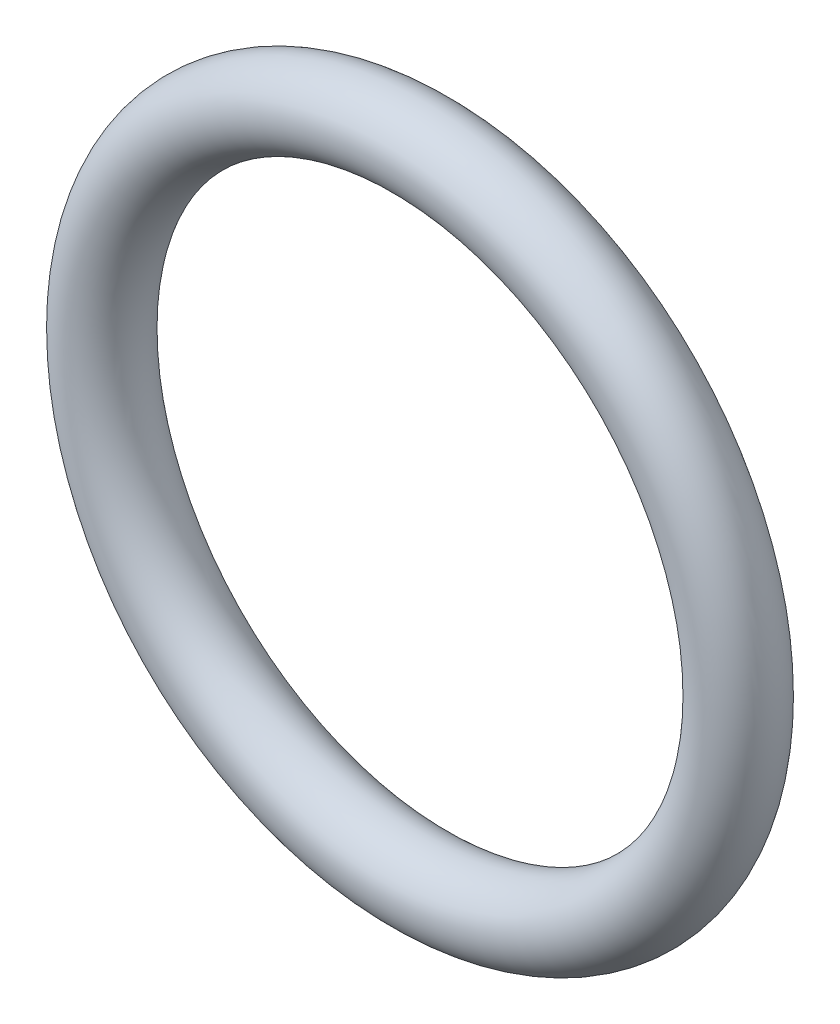
ISO-10303-21;
HEADER;
FILE_DESCRIPTION(('STEP AP214'),'2;1');
FILE_NAME('part.step','',(''),(''),'','','');
FILE_SCHEMA(('AUTOMOTIVE_DESIGN { 1 0 10303 214 1 1 1 1 }'));
ENDSEC;
DATA;
#1=APPLICATION_CONTEXT('core data for automotive mechanical design processes');
#2=APPLICATION_PROTOCOL_DEFINITION('international standard','automotive_design',2000,#1);
#3=PRODUCT_CONTEXT('',#1,'mechanical');
#4=PRODUCT('Part','Part','',(#3));
#5=PRODUCT_RELATED_PRODUCT_CATEGORY('part','',(#4));
#6=PRODUCT_DEFINITION_FORMATION('','',#4);
#7=PRODUCT_DEFINITION_CONTEXT('part definition',#1,'design');
#8=PRODUCT_DEFINITION('design','',#6,#7);
#9=PRODUCT_DEFINITION_SHAPE('','',#8);
#10=(LENGTH_UNIT() NAMED_UNIT(*) SI_UNIT(.MILLI.,.METRE.));
#11=(NAMED_UNIT(*) PLANE_ANGLE_UNIT() SI_UNIT($,.RADIAN.));
#12=(NAMED_UNIT(*) SI_UNIT($,.STERADIAN.) SOLID_ANGLE_UNIT());
#13=UNCERTAINTY_MEASURE_WITH_UNIT(LENGTH_MEASURE(1.E-05),#10,'distance_accuracy_value','');
#14=(GEOMETRIC_REPRESENTATION_CONTEXT(3) GLOBAL_UNCERTAINTY_ASSIGNED_CONTEXT((#13)) GLOBAL_UNIT_ASSIGNED_CONTEXT((#10,
#11,#12)) REPRESENTATION_CONTEXT('',''));
#15=CARTESIAN_POINT('',(0.,0.,0.));
#16=DIRECTION('',(0.,0.,1.));
#17=DIRECTION('',(1.,0.,0.));
#18=AXIS2_PLACEMENT_3D('',#15,#16,#17);
#19=CARTESIAN_POINT('',(0.,0.,0.));
#20=DIRECTION('',(0.,0.,1.));
#21=DIRECTION('',(1.,0.,0.));
#22=AXIS2_PLACEMENT_3D('',#19,#20,#21);
#23=TOROIDAL_SURFACE('',#22,7.239,0.889);
#24=ADVANCED_FACE('F14',(),#23,.T.);
#25=CLOSED_SHELL('',(#24));
#26=MANIFOLD_SOLID_BREP('B1',#25);
#27=ADVANCED_BREP_SHAPE_REPRESENTATION('',(#18,#26),#14);
#28=SHAPE_DEFINITION_REPRESENTATION(#9,#27);
ENDSEC;
END-ISO-10303-21;
